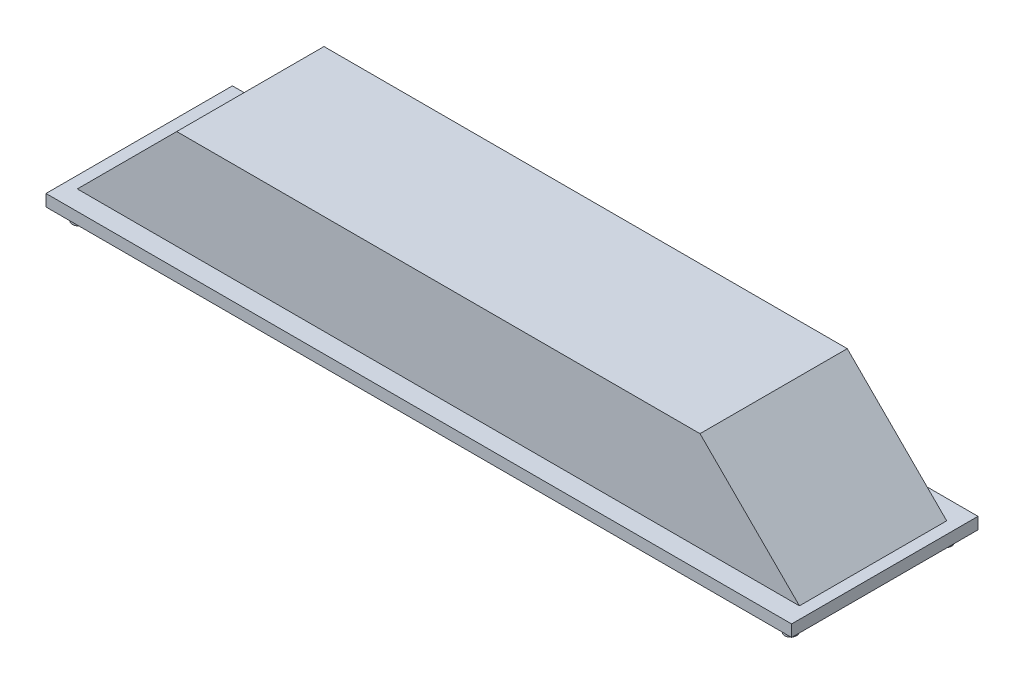
ISO-10303-21;
HEADER;
FILE_DESCRIPTION(('STEP AP214'),'2;1');
FILE_NAME('part.step','',(''),(''),'','','');
FILE_SCHEMA(('AUTOMOTIVE_DESIGN { 1 0 10303 214 1 1 1 1 }'));
ENDSEC;
DATA;
#1=APPLICATION_CONTEXT('core data for automotive mechanical design processes');
#2=APPLICATION_PROTOCOL_DEFINITION('international standard','automotive_design',2000,#1);
#3=PRODUCT_CONTEXT('',#1,'mechanical');
#4=PRODUCT('Part','Part','',(#3));
#5=PRODUCT_RELATED_PRODUCT_CATEGORY('part','',(#4));
#6=PRODUCT_DEFINITION_FORMATION('','',#4);
#7=PRODUCT_DEFINITION_CONTEXT('part definition',#1,'design');
#8=PRODUCT_DEFINITION('design','',#6,#7);
#9=PRODUCT_DEFINITION_SHAPE('','',#8);
#10=(LENGTH_UNIT() NAMED_UNIT(*) SI_UNIT(.MILLI.,.METRE.));
#11=(NAMED_UNIT(*) PLANE_ANGLE_UNIT() SI_UNIT($,.RADIAN.));
#12=(NAMED_UNIT(*) SI_UNIT($,.STERADIAN.) SOLID_ANGLE_UNIT());
#13=UNCERTAINTY_MEASURE_WITH_UNIT(LENGTH_MEASURE(1.E-05),#10,'distance_accuracy_value','');
#14=(GEOMETRIC_REPRESENTATION_CONTEXT(3) GLOBAL_UNCERTAINTY_ASSIGNED_CONTEXT((#13)) GLOBAL_UNIT_ASSIGNED_CONTEXT((#10,
#11,#12)) REPRESENTATION_CONTEXT('',''));
#15=CARTESIAN_POINT('',(0.,0.,0.));
#16=DIRECTION('',(0.,0.,1.));
#17=DIRECTION('',(1.,0.,0.));
#18=AXIS2_PLACEMENT_3D('',#15,#16,#17);
#19=CARTESIAN_POINT('',(0.,0.,0.));
#20=DIRECTION('',(0.,1.,0.));
#21=DIRECTION('',(0.,0.,1.));
#22=AXIS2_PLACEMENT_3D('',#19,#20,#21);
#23=PLANE('',#22);
#24=CARTESIAN_POINT('',(-36.4029437251523,0.,7.92406633356446));
#25=DIRECTION('',(0.,1.,0.));
#26=DIRECTION('',(0.,0.,1.));
#27=AXIS2_PLACEMENT_3D('',#24,#25,#26);
#28=CIRCLE('',#27,0.600000000000001);
#29=CARTESIAN_POINT('',(-36.4029437251523,0.,8.52406633356446));
#30=VERTEX_POINT('',#29);
#31=EDGE_CURVE('E42',#30,#30,#28,.F.);
#32=ORIENTED_EDGE('',*,*,#31,.F.);
#33=EDGE_LOOP('',(#32));
#34=FACE_BOUND('',#33,.T.);
#35=DIRECTION('',(0.,0.,1.));
#36=VECTOR('',#35,1.);
#37=CARTESIAN_POINT('',(36.4029437251523,0.,-84.0210777491003));
#38=LINE('',#37,#36);
#39=CARTESIAN_POINT('',(36.4029437251523,0.,-6.325));
#40=VERTEX_POINT('',#39);
#41=CARTESIAN_POINT('',(36.4029437251523,0.,6.325));
#42=VERTEX_POINT('',#41);
#43=EDGE_CURVE('E139',#40,#42,#38,.T.);
#44=ORIENTED_EDGE('',*,*,#43,.F.);
#45=DIRECTION('',(-1.,0.,0.));
#46=VECTOR('',#45,1.);
#47=CARTESIAN_POINT('',(-38.1,0.,-6.325));
#48=LINE('',#47,#46);
#49=CARTESIAN_POINT('',(-36.4029437251523,0.,-6.325));
#50=VERTEX_POINT('',#49);
#51=EDGE_CURVE('E125',#40,#50,#48,.T.);
#52=ORIENTED_EDGE('',*,*,#51,.T.);
#53=DIRECTION('',(0.,0.,1.));
#54=VECTOR('',#53,1.);
#55=CARTESIAN_POINT('',(-36.4029437251523,0.,0.));
#56=LINE('',#55,#54);
#57=CARTESIAN_POINT('',(-36.4029437251523,0.,6.325));
#58=VERTEX_POINT('',#57);
#59=EDGE_CURVE('E158',#50,#58,#56,.T.);
#60=ORIENTED_EDGE('',*,*,#59,.T.);
#61=DIRECTION('',(1.,0.,0.));
#62=VECTOR('',#61,1.);
#63=CARTESIAN_POINT('',(0.,0.,6.325));
#64=LINE('',#63,#62);
#65=EDGE_CURVE('E146',#58,#42,#64,.T.);
#66=ORIENTED_EDGE('',*,*,#65,.T.);
#67=EDGE_LOOP('',(#44,#52,#60,#66));
#68=FACE_BOUND('',#67,.T.);
#69=DIRECTION('',(0.,0.,-1.));
#70=VECTOR('',#69,1.);
#71=CARTESIAN_POINT('',(38.1,0.,-9.525));
#72=LINE('',#71,#70);
#73=CARTESIAN_POINT('',(38.1,0.,9.525));
#74=VERTEX_POINT('',#73);
#75=CARTESIAN_POINT('',(38.1,0.,-9.525));
#76=VERTEX_POINT('',#75);
#77=EDGE_CURVE('E193',#74,#76,#72,.T.);
#78=ORIENTED_EDGE('',*,*,#77,.F.);
#79=DIRECTION('',(1.,0.,0.));
#80=VECTOR('',#79,1.);
#81=CARTESIAN_POINT('',(-38.1,0.,9.525));
#82=LINE('',#81,#80);
#83=CARTESIAN_POINT('',(-38.1,0.,9.525));
#84=VERTEX_POINT('',#83);
#85=EDGE_CURVE('E198',#84,#74,#82,.T.);
#86=ORIENTED_EDGE('',*,*,#85,.F.);
#87=DIRECTION('',(0.,0.,1.));
#88=VECTOR('',#87,1.);
#89=CARTESIAN_POINT('',(-38.1,0.,-9.525));
#90=LINE('',#89,#88);
#91=CARTESIAN_POINT('',(-38.1,0.,-9.525));
#92=VERTEX_POINT('',#91);
#93=EDGE_CURVE('E209',#92,#84,#90,.T.);
#94=ORIENTED_EDGE('',*,*,#93,.F.);
#95=DIRECTION('',(-1.,0.,0.));
#96=VECTOR('',#95,1.);
#97=CARTESIAN_POINT('',(-38.1,0.,-9.525));
#98=LINE('',#97,#96);
#99=EDGE_CURVE('E207',#76,#92,#98,.T.);
#100=ORIENTED_EDGE('',*,*,#99,.F.);
#101=EDGE_LOOP('',(#78,#86,#94,#100));
#102=FACE_BOUND('',#101,.T.);
#103=CARTESIAN_POINT('',(-36.4029437251523,0.,-7.92406633356446));
#104=DIRECTION('',(0.,1.,0.));
#105=DIRECTION('',(0.,0.,1.));
#106=AXIS2_PLACEMENT_3D('',#103,#104,#105);
#107=CIRCLE('',#106,0.600000000000001);
#108=CARTESIAN_POINT('',(-36.4029437251523,0.,-7.32406633356446));
#109=VERTEX_POINT('',#108);
#110=EDGE_CURVE('E350',#109,#109,#107,.T.);
#111=ORIENTED_EDGE('',*,*,#110,.T.);
#112=EDGE_LOOP('',(#111));
#113=FACE_BOUND('',#112,.T.);
#114=CARTESIAN_POINT('',(36.4029437251523,0.,7.92406633356446));
#115=DIRECTION('',(0.,1.,0.));
#116=DIRECTION('',(0.,0.,-1.));
#117=AXIS2_PLACEMENT_3D('',#114,#115,#116);
#118=CIRCLE('',#117,0.600000000000001);
#119=CARTESIAN_POINT('',(36.4029437251523,0.,7.32406633356446));
#120=VERTEX_POINT('',#119);
#121=EDGE_CURVE('E343',#120,#120,#118,.T.);
#122=ORIENTED_EDGE('',*,*,#121,.T.);
#123=EDGE_LOOP('',(#122));
#124=FACE_BOUND('',#123,.T.);
#125=CARTESIAN_POINT('',(36.4029437251523,0.,-7.92406633356446));
#126=DIRECTION('',(0.,1.,0.));
#127=DIRECTION('',(0.,0.,1.));
#128=AXIS2_PLACEMENT_3D('',#125,#126,#127);
#129=CIRCLE('',#128,0.600000000000001);
#130=CARTESIAN_POINT('',(36.4029437251523,0.,-7.32406633356446));
#131=VERTEX_POINT('',#130);
#132=EDGE_CURVE('E12',#131,#131,#129,.F.);
#133=ORIENTED_EDGE('',*,*,#132,.F.);
#134=EDGE_LOOP('',(#133));
#135=FACE_BOUND('',#134,.T.);
#136=ADVANCED_FACE('F34',(#34,#68,#102,#113,#124,#135),#23,.F.);
#137=CARTESIAN_POINT('',(0.,1.2,0.));
#138=DIRECTION('',(0.,1.,0.));
#139=DIRECTION('',(0.,0.,1.));
#140=AXIS2_PLACEMENT_3D('',#137,#138,#139);
#141=PLANE('',#140);
#142=DIRECTION('',(0.,0.,-1.));
#143=VECTOR('',#142,1.);
#144=CARTESIAN_POINT('',(38.1,1.2,-9.525));
#145=LINE('',#144,#143);
#146=CARTESIAN_POINT('',(38.1,1.2,9.525));
#147=VERTEX_POINT('',#146);
#148=CARTESIAN_POINT('',(38.1,1.2,-9.525));
#149=VERTEX_POINT('',#148);
#150=EDGE_CURVE('E194',#147,#149,#145,.T.);
#151=ORIENTED_EDGE('',*,*,#150,.T.);
#152=DIRECTION('',(-1.,0.,0.));
#153=VECTOR('',#152,1.);
#154=CARTESIAN_POINT('',(-38.1,1.2,-9.525));
#155=LINE('',#154,#153);
#156=CARTESIAN_POINT('',(-38.1,1.2,-9.525));
#157=VERTEX_POINT('',#156);
#158=EDGE_CURVE('E197',#149,#157,#155,.T.);
#159=ORIENTED_EDGE('',*,*,#158,.T.);
#160=DIRECTION('',(0.,0.,1.));
#161=VECTOR('',#160,1.);
#162=CARTESIAN_POINT('',(-38.1,1.2,-9.525));
#163=LINE('',#162,#161);
#164=CARTESIAN_POINT('',(-38.1,1.2,9.525));
#165=VERTEX_POINT('',#164);
#166=EDGE_CURVE('E200',#157,#165,#163,.T.);
#167=ORIENTED_EDGE('',*,*,#166,.T.);
#168=DIRECTION('',(1.,0.,0.));
#169=VECTOR('',#168,1.);
#170=CARTESIAN_POINT('',(-38.1,1.2,9.525));
#171=LINE('',#170,#169);
#172=EDGE_CURVE('E202',#165,#147,#171,.T.);
#173=ORIENTED_EDGE('',*,*,#172,.T.);
#174=EDGE_LOOP('',(#151,#159,#167,#173));
#175=FACE_BOUND('',#174,.T.);
#176=DIRECTION('',(0.,0.,1.));
#177=VECTOR('',#176,1.);
#178=CARTESIAN_POINT('',(36.9,1.2,-84.0210777491003));
#179=LINE('',#178,#177);
#180=CARTESIAN_POINT('',(36.9,1.2,-7.525));
#181=VERTEX_POINT('',#180);
#182=CARTESIAN_POINT('',(36.9,1.2,7.525));
#183=VERTEX_POINT('',#182);
#184=EDGE_CURVE('E57',#181,#183,#179,.T.);
#185=ORIENTED_EDGE('',*,*,#184,.T.);
#186=DIRECTION('',(1.,0.,0.));
#187=VECTOR('',#186,1.);
#188=CARTESIAN_POINT('',(36.9,1.2,7.525));
#189=LINE('',#188,#187);
#190=CARTESIAN_POINT('',(-36.9,1.2,7.525));
#191=VERTEX_POINT('',#190);
#192=EDGE_CURVE('E142',#191,#183,#189,.T.);
#193=ORIENTED_EDGE('',*,*,#192,.F.);
#194=DIRECTION('',(0.,0.,1.));
#195=VECTOR('',#194,1.);
#196=CARTESIAN_POINT('',(-36.9,1.2,-84.0210777491003));
#197=LINE('',#196,#195);
#198=CARTESIAN_POINT('',(-36.9,1.2,-7.525));
#199=VERTEX_POINT('',#198);
#200=EDGE_CURVE('E170',#199,#191,#197,.T.);
#201=ORIENTED_EDGE('',*,*,#200,.F.);
#202=DIRECTION('',(-1.,0.,0.));
#203=VECTOR('',#202,1.);
#204=CARTESIAN_POINT('',(36.9,1.2,-7.525));
#205=LINE('',#204,#203);
#206=EDGE_CURVE('E172',#181,#199,#205,.T.);
#207=ORIENTED_EDGE('',*,*,#206,.F.);
#208=EDGE_LOOP('',(#185,#193,#201,#207));
#209=FACE_BOUND('',#208,.T.);
#210=ADVANCED_FACE('F228',(#175,#209),#141,.T.);
#211=CARTESIAN_POINT('',(38.1,1.2,-9.525));
#212=DIRECTION('',(-1.,0.,0.));
#213=DIRECTION('',(0.,0.,1.));
#214=AXIS2_PLACEMENT_3D('',#211,#212,#213);
#215=PLANE('',#214);
#216=ORIENTED_EDGE('',*,*,#77,.T.);
#217=DIRECTION('',(0.,-1.,0.));
#218=VECTOR('',#217,1.);
#219=CARTESIAN_POINT('',(38.1,1.2,-9.525));
#220=LINE('',#219,#218);
#221=EDGE_CURVE('E220',#149,#76,#220,.T.);
#222=ORIENTED_EDGE('',*,*,#221,.F.);
#223=ORIENTED_EDGE('',*,*,#150,.F.);
#224=DIRECTION('',(0.,-1.,0.));
#225=VECTOR('',#224,1.);
#226=CARTESIAN_POINT('',(38.1,1.2,9.525));
#227=LINE('',#226,#225);
#228=EDGE_CURVE('E204',#147,#74,#227,.T.);
#229=ORIENTED_EDGE('',*,*,#228,.T.);
#230=EDGE_LOOP('',(#216,#222,#223,#229));
#231=FACE_BOUND('',#230,.T.);
#232=ADVANCED_FACE('F36',(#231),#215,.F.);
#233=CARTESIAN_POINT('',(-38.1,1.2,-9.525));
#234=DIRECTION('',(0.,0.,1.));
#235=DIRECTION('',(1.,0.,0.));
#236=AXIS2_PLACEMENT_3D('',#233,#234,#235);
#237=PLANE('',#236);
#238=ORIENTED_EDGE('',*,*,#99,.T.);
#239=DIRECTION('',(0.,-1.,0.));
#240=VECTOR('',#239,1.);
#241=CARTESIAN_POINT('',(-38.1,1.2,-9.525));
#242=LINE('',#241,#240);
#243=EDGE_CURVE('E217',#157,#92,#242,.T.);
#244=ORIENTED_EDGE('',*,*,#243,.F.);
#245=ORIENTED_EDGE('',*,*,#158,.F.);
#246=ORIENTED_EDGE('',*,*,#221,.T.);
#247=EDGE_LOOP('',(#238,#244,#245,#246));
#248=FACE_BOUND('',#247,.T.);
#249=ADVANCED_FACE('F244',(#248),#237,.F.);
#250=CARTESIAN_POINT('',(-38.1,1.2,-9.525));
#251=DIRECTION('',(1.,0.,0.));
#252=DIRECTION('',(0.,0.,-1.));
#253=AXIS2_PLACEMENT_3D('',#250,#251,#252);
#254=PLANE('',#253);
#255=ORIENTED_EDGE('',*,*,#93,.T.);
#256=DIRECTION('',(0.,-1.,0.));
#257=VECTOR('',#256,1.);
#258=CARTESIAN_POINT('',(-38.1,1.2,9.525));
#259=LINE('',#258,#257);
#260=EDGE_CURVE('E214',#165,#84,#259,.T.);
#261=ORIENTED_EDGE('',*,*,#260,.F.);
#262=ORIENTED_EDGE('',*,*,#166,.F.);
#263=ORIENTED_EDGE('',*,*,#243,.T.);
#264=EDGE_LOOP('',(#255,#261,#262,#263));
#265=FACE_BOUND('',#264,.T.);
#266=ADVANCED_FACE('F241',(#265),#254,.F.);
#267=CARTESIAN_POINT('',(-38.1,1.2,9.525));
#268=DIRECTION('',(0.,0.,-1.));
#269=DIRECTION('',(-1.,0.,0.));
#270=AXIS2_PLACEMENT_3D('',#267,#268,#269);
#271=PLANE('',#270);
#272=ORIENTED_EDGE('',*,*,#85,.T.);
#273=ORIENTED_EDGE('',*,*,#228,.F.);
#274=ORIENTED_EDGE('',*,*,#172,.F.);
#275=ORIENTED_EDGE('',*,*,#260,.T.);
#276=EDGE_LOOP('',(#272,#273,#274,#275));
#277=FACE_BOUND('',#276,.T.);
#278=ADVANCED_FACE('F237',(#277),#271,.F.);
#279=CARTESIAN_POINT('',(-36.9,1.2,-84.0210777491003));
#280=DIRECTION('',(-0.707106781186544,0.707106781186551,0.));
#281=DIRECTION('',(-0.707106781186551,-0.707106781186544,0.));
#282=AXIS2_PLACEMENT_3D('',#279,#280,#281);
#283=PLANE('',#282);
#284=DIRECTION('',(0.707106781186551,0.707106781186544,0.));
#285=VECTOR('',#284,1.);
#286=CARTESIAN_POINT('',(-36.9,1.2,-7.525));
#287=LINE('',#286,#285);
#288=CARTESIAN_POINT('',(-26.7399999999999,11.36,-7.525));
#289=VERTEX_POINT('',#288);
#290=EDGE_CURVE('E169',#199,#289,#287,.T.);
#291=ORIENTED_EDGE('',*,*,#290,.F.);
#292=ORIENTED_EDGE('',*,*,#200,.T.);
#293=DIRECTION('',(-0.707106781186551,-0.707106781186544,0.));
#294=VECTOR('',#293,1.);
#295=CARTESIAN_POINT('',(-36.9,1.2,7.525));
#296=LINE('',#295,#294);
#297=CARTESIAN_POINT('',(-26.7399999999999,11.36,7.525));
#298=VERTEX_POINT('',#297);
#299=EDGE_CURVE('E183',#298,#191,#296,.T.);
#300=ORIENTED_EDGE('',*,*,#299,.F.);
#301=DIRECTION('',(0.,0.,1.));
#302=VECTOR('',#301,1.);
#303=CARTESIAN_POINT('',(-26.7399999999999,11.36,-84.0210777491003));
#304=LINE('',#303,#302);
#305=EDGE_CURVE('E187',#289,#298,#304,.T.);
#306=ORIENTED_EDGE('',*,*,#305,.F.);
#307=EDGE_LOOP('',(#291,#292,#300,#306));
#308=FACE_BOUND('',#307,.T.);
#309=ADVANCED_FACE('F240',(#308),#283,.T.);
#310=CARTESIAN_POINT('',(-26.7399999999999,11.36,-84.0210777491003));
#311=DIRECTION('',(0.,1.,0.));
#312=DIRECTION('',(0.,0.,1.));
#313=AXIS2_PLACEMENT_3D('',#310,#311,#312);
#314=PLANE('',#313);
#315=DIRECTION('',(1.,0.,0.));
#316=VECTOR('',#315,1.);
#317=CARTESIAN_POINT('',(-26.7399999999999,11.36,-7.525));
#318=LINE('',#317,#316);
#319=CARTESIAN_POINT('',(26.7399999999999,11.36,-7.525));
#320=VERTEX_POINT('',#319);
#321=EDGE_CURVE('E167',#289,#320,#318,.T.);
#322=ORIENTED_EDGE('',*,*,#321,.F.);
#323=ORIENTED_EDGE('',*,*,#305,.T.);
#324=DIRECTION('',(-1.,0.,0.));
#325=VECTOR('',#324,1.);
#326=CARTESIAN_POINT('',(-26.7399999999999,11.36,7.525));
#327=LINE('',#326,#325);
#328=CARTESIAN_POINT('',(26.7399999999999,11.36,7.525));
#329=VERTEX_POINT('',#328);
#330=EDGE_CURVE('E180',#329,#298,#327,.T.);
#331=ORIENTED_EDGE('',*,*,#330,.F.);
#332=DIRECTION('',(0.,0.,1.));
#333=VECTOR('',#332,1.);
#334=CARTESIAN_POINT('',(26.7399999999999,11.36,-84.0210777491003));
#335=LINE('',#334,#333);
#336=EDGE_CURVE('E189',#320,#329,#335,.T.);
#337=ORIENTED_EDGE('',*,*,#336,.F.);
#338=EDGE_LOOP('',(#322,#323,#331,#337));
#339=FACE_BOUND('',#338,.T.);
#340=ADVANCED_FACE('F276',(#339),#314,.T.);
#341=CARTESIAN_POINT('',(26.7399999999999,11.36,-84.0210777491003));
#342=DIRECTION('',(0.707106781186544,0.707106781186551,0.));
#343=DIRECTION('',(-0.707106781186551,0.707106781186544,0.));
#344=AXIS2_PLACEMENT_3D('',#341,#342,#343);
#345=PLANE('',#344);
#346=DIRECTION('',(0.707106781186551,-0.707106781186544,0.));
#347=VECTOR('',#346,1.);
#348=CARTESIAN_POINT('',(26.7399999999999,11.36,-7.525));
#349=LINE('',#348,#347);
#350=EDGE_CURVE('E174',#320,#181,#349,.T.);
#351=ORIENTED_EDGE('',*,*,#350,.F.);
#352=ORIENTED_EDGE('',*,*,#336,.T.);
#353=DIRECTION('',(-0.707106781186551,0.707106781186544,0.));
#354=VECTOR('',#353,1.);
#355=CARTESIAN_POINT('',(26.7399999999999,11.36,7.525));
#356=LINE('',#355,#354);
#357=EDGE_CURVE('E177',#183,#329,#356,.T.);
#358=ORIENTED_EDGE('',*,*,#357,.F.);
#359=ORIENTED_EDGE('',*,*,#184,.F.);
#360=EDGE_LOOP('',(#351,#352,#358,#359));
#361=FACE_BOUND('',#360,.T.);
#362=ADVANCED_FACE('F280',(#361),#345,.T.);
#363=CARTESIAN_POINT('',(0.,0.,7.525));
#364=DIRECTION('',(0.,0.,-1.));
#365=DIRECTION('',(-1.,0.,0.));
#366=AXIS2_PLACEMENT_3D('',#363,#364,#365);
#367=PLANE('',#366);
#368=ORIENTED_EDGE('',*,*,#192,.T.);
#369=ORIENTED_EDGE('',*,*,#357,.T.);
#370=ORIENTED_EDGE('',*,*,#330,.T.);
#371=ORIENTED_EDGE('',*,*,#299,.T.);
#372=EDGE_LOOP('',(#368,#369,#370,#371));
#373=FACE_BOUND('',#372,.T.);
#374=ADVANCED_FACE('F279',(#373),#367,.F.);
#375=CARTESIAN_POINT('',(-38.1,1.2,-7.525));
#376=DIRECTION('',(0.,0.,1.));
#377=DIRECTION('',(1.,0.,0.));
#378=AXIS2_PLACEMENT_3D('',#375,#376,#377);
#379=PLANE('',#378);
#380=ORIENTED_EDGE('',*,*,#206,.T.);
#381=ORIENTED_EDGE('',*,*,#290,.T.);
#382=ORIENTED_EDGE('',*,*,#321,.T.);
#383=ORIENTED_EDGE('',*,*,#350,.T.);
#384=EDGE_LOOP('',(#380,#381,#382,#383));
#385=FACE_BOUND('',#384,.T.);
#386=ADVANCED_FACE('F269',(#385),#379,.F.);
#387=CARTESIAN_POINT('',(-36.0514718625761,0.351471862576139,-84.0210777491003));
#388=DIRECTION('',(-0.707106781186544,0.707106781186551,0.));
#389=DIRECTION('',(-0.707106781186551,-0.707106781186544,0.));
#390=AXIS2_PLACEMENT_3D('',#387,#388,#389);
#391=PLANE('',#390);
#392=DIRECTION('',(0.707106781186551,0.707106781186544,0.));
#393=VECTOR('',#392,1.);
#394=CARTESIAN_POINT('',(-36.0514718625761,0.351471862576139,-6.325));
#395=LINE('',#394,#393);
#396=CARTESIAN_POINT('',(-26.2429437251522,10.16,-6.325));
#397=VERTEX_POINT('',#396);
#398=EDGE_CURVE('E130',#50,#397,#395,.T.);
#399=ORIENTED_EDGE('',*,*,#398,.T.);
#400=DIRECTION('',(0.,0.,1.));
#401=VECTOR('',#400,1.);
#402=CARTESIAN_POINT('',(-26.2429437251522,10.16,-84.0210777491003));
#403=LINE('',#402,#401);
#404=CARTESIAN_POINT('',(-26.2429437251522,10.16,6.325));
#405=VERTEX_POINT('',#404);
#406=EDGE_CURVE('E148',#397,#405,#403,.T.);
#407=ORIENTED_EDGE('',*,*,#406,.T.);
#408=DIRECTION('',(-0.707106781186551,-0.707106781186544,0.));
#409=VECTOR('',#408,1.);
#410=CARTESIAN_POINT('',(-36.0514718625761,0.351471862576139,6.325));
#411=LINE('',#410,#409);
#412=EDGE_CURVE('E49',#405,#58,#411,.T.);
#413=ORIENTED_EDGE('',*,*,#412,.T.);
#414=ORIENTED_EDGE('',*,*,#59,.F.);
#415=EDGE_LOOP('',(#399,#407,#413,#414));
#416=FACE_BOUND('',#415,.T.);
#417=ADVANCED_FACE('F293',(#416),#391,.F.);
#418=CARTESIAN_POINT('',(-26.7399999999999,10.16,-84.0210777491003));
#419=DIRECTION('',(0.,1.,0.));
#420=DIRECTION('',(0.,0.,1.));
#421=AXIS2_PLACEMENT_3D('',#418,#419,#420);
#422=PLANE('',#421);
#423=DIRECTION('',(1.,0.,0.));
#424=VECTOR('',#423,1.);
#425=CARTESIAN_POINT('',(-26.7399999999999,10.16,-6.325));
#426=LINE('',#425,#424);
#427=CARTESIAN_POINT('',(26.2429437251522,10.16,-6.325));
#428=VERTEX_POINT('',#427);
#429=EDGE_CURVE('E159',#397,#428,#426,.T.);
#430=ORIENTED_EDGE('',*,*,#429,.T.);
#431=DIRECTION('',(0.,0.,1.));
#432=VECTOR('',#431,1.);
#433=CARTESIAN_POINT('',(26.2429437251522,10.16,-84.0210777491003));
#434=LINE('',#433,#432);
#435=CARTESIAN_POINT('',(26.2429437251522,10.16,6.325));
#436=VERTEX_POINT('',#435);
#437=EDGE_CURVE('E141',#428,#436,#434,.T.);
#438=ORIENTED_EDGE('',*,*,#437,.T.);
#439=DIRECTION('',(-1.,0.,0.));
#440=VECTOR('',#439,1.);
#441=CARTESIAN_POINT('',(-26.7399999999999,10.16,6.325));
#442=LINE('',#441,#440);
#443=EDGE_CURVE('E150',#436,#405,#442,.T.);
#444=ORIENTED_EDGE('',*,*,#443,.T.);
#445=ORIENTED_EDGE('',*,*,#406,.F.);
#446=EDGE_LOOP('',(#430,#438,#444,#445));
#447=FACE_BOUND('',#446,.T.);
#448=ADVANCED_FACE('F302',(#447),#422,.F.);
#449=CARTESIAN_POINT('',(25.8914718625761,10.5114718625761,-84.0210777491003));
#450=DIRECTION('',(0.707106781186544,0.707106781186551,0.));
#451=DIRECTION('',(-0.707106781186551,0.707106781186544,0.));
#452=AXIS2_PLACEMENT_3D('',#449,#450,#451);
#453=PLANE('',#452);
#454=DIRECTION('',(0.707106781186551,-0.707106781186544,0.));
#455=VECTOR('',#454,1.);
#456=CARTESIAN_POINT('',(25.8914718625761,10.5114718625761,-6.325));
#457=LINE('',#456,#455);
#458=EDGE_CURVE('E129',#428,#40,#457,.T.);
#459=ORIENTED_EDGE('',*,*,#458,.T.);
#460=ORIENTED_EDGE('',*,*,#43,.T.);
#461=DIRECTION('',(-0.707106781186551,0.707106781186544,0.));
#462=VECTOR('',#461,1.);
#463=CARTESIAN_POINT('',(25.8914718625761,10.5114718625761,6.325));
#464=LINE('',#463,#462);
#465=EDGE_CURVE('E157',#42,#436,#464,.T.);
#466=ORIENTED_EDGE('',*,*,#465,.T.);
#467=ORIENTED_EDGE('',*,*,#437,.F.);
#468=EDGE_LOOP('',(#459,#460,#466,#467));
#469=FACE_BOUND('',#468,.T.);
#470=ADVANCED_FACE('F137',(#469),#453,.F.);
#471=CARTESIAN_POINT('',(0.,0.,6.325));
#472=DIRECTION('',(0.,0.,-1.));
#473=DIRECTION('',(-1.,0.,0.));
#474=AXIS2_PLACEMENT_3D('',#471,#472,#473);
#475=PLANE('',#474);
#476=ORIENTED_EDGE('',*,*,#65,.F.);
#477=ORIENTED_EDGE('',*,*,#412,.F.);
#478=ORIENTED_EDGE('',*,*,#443,.F.);
#479=ORIENTED_EDGE('',*,*,#465,.F.);
#480=EDGE_LOOP('',(#476,#477,#478,#479));
#481=FACE_BOUND('',#480,.T.);
#482=ADVANCED_FACE('F296',(#481),#475,.T.);
#483=CARTESIAN_POINT('',(-38.1,1.2,-6.325));
#484=DIRECTION('',(0.,0.,1.));
#485=DIRECTION('',(1.,0.,0.));
#486=AXIS2_PLACEMENT_3D('',#483,#484,#485);
#487=PLANE('',#486);
#488=ORIENTED_EDGE('',*,*,#51,.F.);
#489=ORIENTED_EDGE('',*,*,#458,.F.);
#490=ORIENTED_EDGE('',*,*,#429,.F.);
#491=ORIENTED_EDGE('',*,*,#398,.F.);
#492=EDGE_LOOP('',(#488,#489,#490,#491));
#493=FACE_BOUND('',#492,.T.);
#494=ADVANCED_FACE('F127',(#493),#487,.T.);
#495=CARTESIAN_POINT('',(-36.4029437251523,-1.2,7.92406633356446));
#496=DIRECTION('',(0.,1.,0.));
#497=DIRECTION('',(0.,0.,1.));
#498=AXIS2_PLACEMENT_3D('',#495,#496,#497);
#499=CYLINDRICAL_SURFACE('',#498,0.600000000000001);
#500=CARTESIAN_POINT('',(-36.4029437251523,-1.2,7.92406633356446));
#501=DIRECTION('',(0.,-1.,0.));
#502=DIRECTION('',(0.,0.,-1.));
#503=AXIS2_PLACEMENT_3D('',#500,#501,#502);
#504=CIRCLE('',#503,0.600000000000001);
#505=CARTESIAN_POINT('',(-36.4029437251523,-1.2,7.32406633356446));
#506=VERTEX_POINT('',#505);
#507=EDGE_CURVE('E154',#506,#506,#504,.T.);
#508=ORIENTED_EDGE('',*,*,#507,.F.);
#509=EDGE_LOOP('',(#508));
#510=FACE_BOUND('',#509,.T.);
#511=ORIENTED_EDGE('',*,*,#31,.T.);
#512=EDGE_LOOP('',(#511));
#513=FACE_BOUND('',#512,.T.);
#514=ADVANCED_FACE('F225',(#510,#513),#499,.T.);
#515=CARTESIAN_POINT('',(-36.4029437251523,-1.2,7.92406633356446));
#516=DIRECTION('',(0.,-1.,0.));
#517=DIRECTION('',(0.,0.,-1.));
#518=AXIS2_PLACEMENT_3D('',#515,#516,#517);
#519=PLANE('',#518);
#520=ORIENTED_EDGE('',*,*,#507,.T.);
#521=EDGE_LOOP('',(#520));
#522=FACE_BOUND('',#521,.T.);
#523=ADVANCED_FACE('F310',(#522),#519,.T.);
#524=CARTESIAN_POINT('',(-36.4029437251523,-1.2,-7.92406633356446));
#525=DIRECTION('',(0.,1.,0.));
#526=DIRECTION('',(0.,0.,1.));
#527=AXIS2_PLACEMENT_3D('',#524,#525,#526);
#528=CYLINDRICAL_SURFACE('',#527,0.600000000000001);
#529=CARTESIAN_POINT('',(-36.4029437251523,-1.2,-7.92406633356446));
#530=DIRECTION('',(0.,1.,0.));
#531=DIRECTION('',(0.,0.,1.));
#532=AXIS2_PLACEMENT_3D('',#529,#530,#531);
#533=CIRCLE('',#532,0.600000000000001);
#534=CARTESIAN_POINT('',(-36.4029437251523,-1.2,-7.32406633356446));
#535=VERTEX_POINT('',#534);
#536=EDGE_CURVE('E352',#535,#535,#533,.T.);
#537=ORIENTED_EDGE('',*,*,#536,.T.);
#538=EDGE_LOOP('',(#537));
#539=FACE_BOUND('',#538,.T.);
#540=ORIENTED_EDGE('',*,*,#110,.F.);
#541=EDGE_LOOP('',(#540));
#542=FACE_BOUND('',#541,.T.);
#543=ADVANCED_FACE('F314',(#539,#542),#528,.T.);
#544=CARTESIAN_POINT('',(-36.4029437251523,-1.2,-7.92406633356446));
#545=DIRECTION('',(0.,-1.,0.));
#546=DIRECTION('',(0.,0.,1.));
#547=AXIS2_PLACEMENT_3D('',#544,#545,#546);
#548=PLANE('',#547);
#549=ORIENTED_EDGE('',*,*,#536,.F.);
#550=EDGE_LOOP('',(#549));
#551=FACE_BOUND('',#550,.T.);
#552=ADVANCED_FACE('F318',(#551),#548,.T.);
#553=CARTESIAN_POINT('',(36.4029437251523,-1.2,7.92406633356446));
#554=DIRECTION('',(0.,1.,0.));
#555=DIRECTION('',(0.,0.,1.));
#556=AXIS2_PLACEMENT_3D('',#553,#554,#555);
#557=CYLINDRICAL_SURFACE('',#556,0.600000000000001);
#558=CARTESIAN_POINT('',(36.4029437251523,-1.2,7.92406633356446));
#559=DIRECTION('',(0.,1.,0.));
#560=DIRECTION('',(0.,0.,-1.));
#561=AXIS2_PLACEMENT_3D('',#558,#559,#560);
#562=CIRCLE('',#561,0.600000000000001);
#563=CARTESIAN_POINT('',(36.4029437251523,-1.2,7.32406633356446));
#564=VERTEX_POINT('',#563);
#565=EDGE_CURVE('E346',#564,#564,#562,.T.);
#566=ORIENTED_EDGE('',*,*,#565,.T.);
#567=EDGE_LOOP('',(#566));
#568=FACE_BOUND('',#567,.T.);
#569=ORIENTED_EDGE('',*,*,#121,.F.);
#570=EDGE_LOOP('',(#569));
#571=FACE_BOUND('',#570,.T.);
#572=ADVANCED_FACE('F322',(#568,#571),#557,.T.);
#573=CARTESIAN_POINT('',(36.4029437251523,-1.2,7.92406633356446));
#574=DIRECTION('',(0.,-1.,0.));
#575=DIRECTION('',(0.,0.,-1.));
#576=AXIS2_PLACEMENT_3D('',#573,#574,#575);
#577=PLANE('',#576);
#578=ORIENTED_EDGE('',*,*,#565,.F.);
#579=EDGE_LOOP('',(#578));
#580=FACE_BOUND('',#579,.T.);
#581=ADVANCED_FACE('F326',(#580),#577,.T.);
#582=CARTESIAN_POINT('',(36.4029437251523,-1.2,-7.92406633356446));
#583=DIRECTION('',(0.,1.,0.));
#584=DIRECTION('',(0.,0.,1.));
#585=AXIS2_PLACEMENT_3D('',#582,#583,#584);
#586=CYLINDRICAL_SURFACE('',#585,0.600000000000001);
#587=CARTESIAN_POINT('',(36.4029437251523,-1.2,-7.92406633356446));
#588=DIRECTION('',(0.,-1.,0.));
#589=DIRECTION('',(0.,0.,1.));
#590=AXIS2_PLACEMENT_3D('',#587,#588,#589);
#591=CIRCLE('',#590,0.600000000000001);
#592=CARTESIAN_POINT('',(36.4029437251523,-1.2,-7.32406633356446));
#593=VERTEX_POINT('',#592);
#594=EDGE_CURVE('E342',#593,#593,#591,.T.);
#595=ORIENTED_EDGE('',*,*,#594,.F.);
#596=EDGE_LOOP('',(#595));
#597=FACE_BOUND('',#596,.T.);
#598=ORIENTED_EDGE('',*,*,#132,.T.);
#599=EDGE_LOOP('',(#598));
#600=FACE_BOUND('',#599,.T.);
#601=ADVANCED_FACE('F330',(#597,#600),#586,.T.);
#602=CARTESIAN_POINT('',(36.4029437251523,-1.2,-7.92406633356446));
#603=DIRECTION('',(0.,-1.,0.));
#604=DIRECTION('',(0.,0.,1.));
#605=AXIS2_PLACEMENT_3D('',#602,#603,#604);
#606=PLANE('',#605);
#607=ORIENTED_EDGE('',*,*,#594,.T.);
#608=EDGE_LOOP('',(#607));
#609=FACE_BOUND('',#608,.T.);
#610=ADVANCED_FACE('F334',(#609),#606,.T.);
#611=CLOSED_SHELL('',(#136,#210,#232,#249,#266,#278,#309,#340,#362,#374,#386,#417,#448,#470,
#482,#494,#514,#523,#543,#552,#572,#581,#601,#610));
#612=MANIFOLD_SOLID_BREP('B2',#611);
#613=ADVANCED_BREP_SHAPE_REPRESENTATION('',(#18,#612),#14);
#614=SHAPE_DEFINITION_REPRESENTATION(#9,#613);
ENDSEC;
END-ISO-10303-21;
